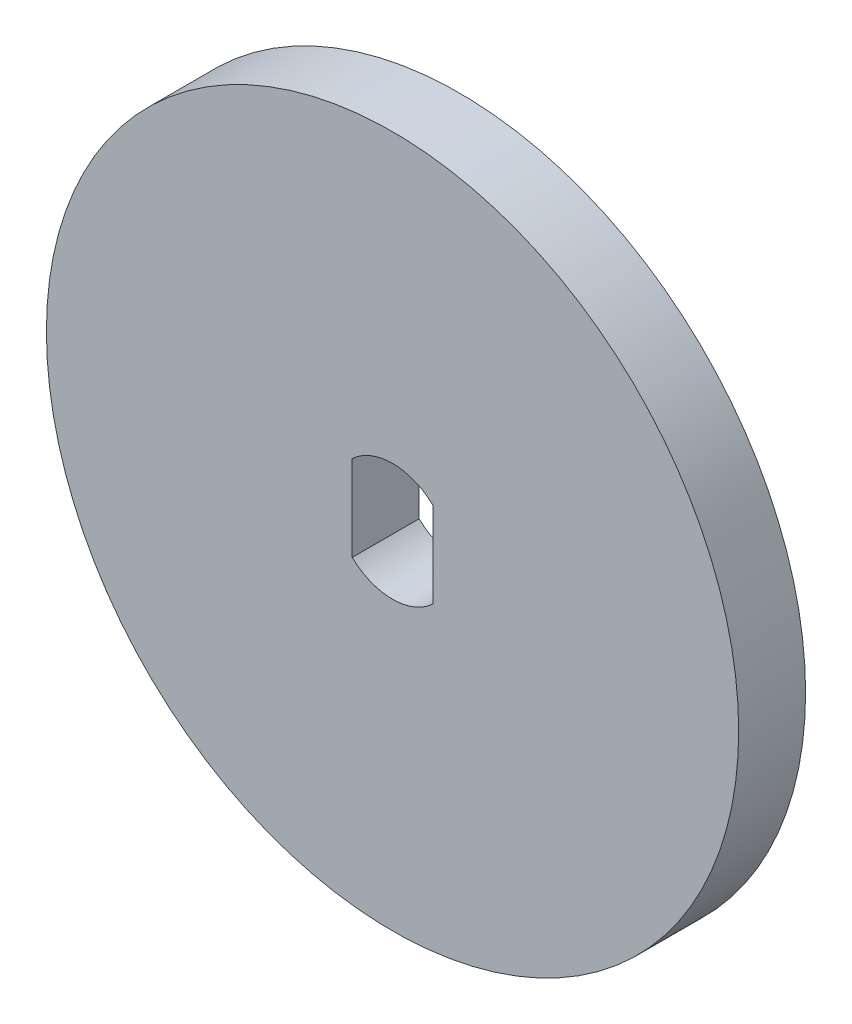
ISO-10303-21;
HEADER;
FILE_DESCRIPTION(('STEP AP214'),'2;1');
FILE_NAME('part.step','',(''),(''),'','','');
FILE_SCHEMA(('AUTOMOTIVE_DESIGN { 1 0 10303 214 1 1 1 1 }'));
ENDSEC;
DATA;
#1=APPLICATION_CONTEXT('core data for automotive mechanical design processes');
#2=APPLICATION_PROTOCOL_DEFINITION('international standard','automotive_design',2000,#1);
#3=PRODUCT_CONTEXT('',#1,'mechanical');
#4=PRODUCT('Part','Part','',(#3));
#5=PRODUCT_RELATED_PRODUCT_CATEGORY('part','',(#4));
#6=PRODUCT_DEFINITION_FORMATION('','',#4);
#7=PRODUCT_DEFINITION_CONTEXT('part definition',#1,'design');
#8=PRODUCT_DEFINITION('design','',#6,#7);
#9=PRODUCT_DEFINITION_SHAPE('','',#8);
#10=(LENGTH_UNIT() NAMED_UNIT(*) SI_UNIT(.MILLI.,.METRE.));
#11=(NAMED_UNIT(*) PLANE_ANGLE_UNIT() SI_UNIT($,.RADIAN.));
#12=(NAMED_UNIT(*) SI_UNIT($,.STERADIAN.) SOLID_ANGLE_UNIT());
#13=UNCERTAINTY_MEASURE_WITH_UNIT(LENGTH_MEASURE(1.E-05),#10,'distance_accuracy_value','');
#14=(GEOMETRIC_REPRESENTATION_CONTEXT(3) GLOBAL_UNCERTAINTY_ASSIGNED_CONTEXT((#13)) GLOBAL_UNIT_ASSIGNED_CONTEXT((#10,
#11,#12)) REPRESENTATION_CONTEXT('',''));
#15=CARTESIAN_POINT('',(0.,0.,0.));
#16=DIRECTION('',(0.,0.,1.));
#17=DIRECTION('',(1.,0.,0.));
#18=AXIS2_PLACEMENT_3D('',#15,#16,#17);
#19=CARTESIAN_POINT('',(0.,0.,1.45));
#20=DIRECTION('',(0.,0.,1.));
#21=DIRECTION('',(1.,0.,0.));
#22=AXIS2_PLACEMENT_3D('',#19,#20,#21);
#23=PLANE('',#22);
#24=CARTESIAN_POINT('',(0.,0.,1.45));
#25=DIRECTION('',(0.,0.,1.));
#26=DIRECTION('',(1.,0.,0.));
#27=AXIS2_PLACEMENT_3D('',#24,#25,#26);
#28=CIRCLE('',#27,15.);
#29=CARTESIAN_POINT('',(15.,0.,1.45));
#30=VERTEX_POINT('',#29);
#31=EDGE_CURVE('E11',#30,#30,#28,.T.);
#32=ORIENTED_EDGE('',*,*,#31,.T.);
#33=EDGE_LOOP('',(#32));
#34=FACE_BOUND('',#33,.T.);
#35=DIRECTION('',(0.,-1.,0.));
#36=VECTOR('',#35,1.);
#37=CARTESIAN_POINT('',(-1.75,-1.85472369909914,1.45));
#38=LINE('',#37,#36);
#39=CARTESIAN_POINT('',(-1.75,1.85472369909914,1.45));
#40=VERTEX_POINT('',#39);
#41=CARTESIAN_POINT('',(-1.75,-1.85472369909914,1.45));
#42=VERTEX_POINT('',#41);
#43=EDGE_CURVE('E90',#40,#42,#38,.T.);
#44=ORIENTED_EDGE('',*,*,#43,.F.);
#45=CARTESIAN_POINT('',(0.,0.,1.45));
#46=DIRECTION('',(0.,0.,1.));
#47=DIRECTION('',(1.,0.,0.));
#48=AXIS2_PLACEMENT_3D('',#45,#46,#47);
#49=CIRCLE('',#48,2.55);
#50=CARTESIAN_POINT('',(1.75,1.85472369909914,1.45));
#51=VERTEX_POINT('',#50);
#52=EDGE_CURVE('E81',#51,#40,#49,.T.);
#53=ORIENTED_EDGE('',*,*,#52,.F.);
#54=DIRECTION('',(0.,1.,0.));
#55=VECTOR('',#54,1.);
#56=CARTESIAN_POINT('',(1.75,-1.85472369909914,1.45));
#57=LINE('',#56,#55);
#58=CARTESIAN_POINT('',(1.75,-1.85472369909914,1.45));
#59=VERTEX_POINT('',#58);
#60=EDGE_CURVE('E106',#59,#51,#57,.T.);
#61=ORIENTED_EDGE('',*,*,#60,.F.);
#62=CARTESIAN_POINT('',(0.,0.,1.45));
#63=DIRECTION('',(0.,0.,1.));
#64=DIRECTION('',(1.,0.,0.));
#65=AXIS2_PLACEMENT_3D('',#62,#63,#64);
#66=CIRCLE('',#65,2.55);
#67=EDGE_CURVE('E102',#42,#59,#66,.T.);
#68=ORIENTED_EDGE('',*,*,#67,.F.);
#69=EDGE_LOOP('',(#44,#53,#61,#68));
#70=FACE_BOUND('',#69,.T.);
#71=ADVANCED_FACE('F39',(#34,#70),#23,.T.);
#72=CARTESIAN_POINT('',(0.,0.,-1.45));
#73=DIRECTION('',(0.,0.,1.));
#74=DIRECTION('',(1.,0.,0.));
#75=AXIS2_PLACEMENT_3D('',#72,#73,#74);
#76=PLANE('',#75);
#77=CARTESIAN_POINT('',(0.,0.,-1.45));
#78=DIRECTION('',(0.,0.,1.));
#79=DIRECTION('',(1.,0.,0.));
#80=AXIS2_PLACEMENT_3D('',#77,#78,#79);
#81=CIRCLE('',#80,15.);
#82=CARTESIAN_POINT('',(15.,0.,-1.45));
#83=VERTEX_POINT('',#82);
#84=EDGE_CURVE('E43',#83,#83,#81,.T.);
#85=ORIENTED_EDGE('',*,*,#84,.F.);
#86=EDGE_LOOP('',(#85));
#87=FACE_BOUND('',#86,.T.);
#88=CARTESIAN_POINT('',(0.,0.,-1.45));
#89=DIRECTION('',(0.,0.,1.));
#90=DIRECTION('',(1.,0.,0.));
#91=AXIS2_PLACEMENT_3D('',#88,#89,#90);
#92=CIRCLE('',#91,2.55);
#93=CARTESIAN_POINT('',(1.75,1.85472369909914,-1.45));
#94=VERTEX_POINT('',#93);
#95=CARTESIAN_POINT('',(-1.75,1.85472369909914,-1.45));
#96=VERTEX_POINT('',#95);
#97=EDGE_CURVE('E63',#94,#96,#92,.T.);
#98=ORIENTED_EDGE('',*,*,#97,.T.);
#99=DIRECTION('',(0.,-1.,0.));
#100=VECTOR('',#99,1.);
#101=CARTESIAN_POINT('',(-1.75,-1.85472369909914,-1.45));
#102=LINE('',#101,#100);
#103=CARTESIAN_POINT('',(-1.75,-1.85472369909914,-1.45));
#104=VERTEX_POINT('',#103);
#105=EDGE_CURVE('E97',#96,#104,#102,.T.);
#106=ORIENTED_EDGE('',*,*,#105,.T.);
#107=CARTESIAN_POINT('',(0.,0.,-1.45));
#108=DIRECTION('',(0.,0.,1.));
#109=DIRECTION('',(1.,0.,0.));
#110=AXIS2_PLACEMENT_3D('',#107,#108,#109);
#111=CIRCLE('',#110,2.55);
#112=CARTESIAN_POINT('',(1.75,-1.85472369909914,-1.45));
#113=VERTEX_POINT('',#112);
#114=EDGE_CURVE('E115',#104,#113,#111,.T.);
#115=ORIENTED_EDGE('',*,*,#114,.T.);
#116=DIRECTION('',(0.,1.,0.));
#117=VECTOR('',#116,1.);
#118=CARTESIAN_POINT('',(1.75,-1.85472369909914,-1.45));
#119=LINE('',#118,#117);
#120=EDGE_CURVE('E91',#113,#94,#119,.T.);
#121=ORIENTED_EDGE('',*,*,#120,.T.);
#122=EDGE_LOOP('',(#98,#106,#115,#121));
#123=FACE_BOUND('',#122,.T.);
#124=ADVANCED_FACE('F131',(#87,#123),#76,.F.);
#125=CARTESIAN_POINT('',(0.,0.,1.45));
#126=DIRECTION('',(0.,0.,-1.));
#127=DIRECTION('',(-1.,0.,0.));
#128=AXIS2_PLACEMENT_3D('',#125,#126,#127);
#129=CYLINDRICAL_SURFACE('',#128,15.);
#130=ORIENTED_EDGE('',*,*,#31,.F.);
#131=EDGE_LOOP('',(#130));
#132=FACE_BOUND('',#131,.T.);
#133=ORIENTED_EDGE('',*,*,#84,.T.);
#134=EDGE_LOOP('',(#133));
#135=FACE_BOUND('',#134,.T.);
#136=ADVANCED_FACE('F41',(#132,#135),#129,.T.);
#137=CARTESIAN_POINT('',(0.,0.,1.45));
#138=DIRECTION('',(0.,0.,-1.));
#139=DIRECTION('',(-1.,0.,0.));
#140=AXIS2_PLACEMENT_3D('',#137,#138,#139);
#141=CYLINDRICAL_SURFACE('',#140,2.55);
#142=ORIENTED_EDGE('',*,*,#97,.F.);
#143=DIRECTION('',(0.,0.,-1.));
#144=VECTOR('',#143,1.);
#145=CARTESIAN_POINT('',(1.75,1.85472369909914,1.45));
#146=LINE('',#145,#144);
#147=EDGE_CURVE('E85',#51,#94,#146,.T.);
#148=ORIENTED_EDGE('',*,*,#147,.F.);
#149=ORIENTED_EDGE('',*,*,#52,.T.);
#150=DIRECTION('',(0.,0.,-1.));
#151=VECTOR('',#150,1.);
#152=CARTESIAN_POINT('',(-1.75,1.85472369909914,1.45));
#153=LINE('',#152,#151);
#154=EDGE_CURVE('E84',#40,#96,#153,.T.);
#155=ORIENTED_EDGE('',*,*,#154,.T.);
#156=EDGE_LOOP('',(#142,#148,#149,#155));
#157=FACE_BOUND('',#156,.T.);
#158=ADVANCED_FACE('F83',(#157),#141,.F.);
#159=CARTESIAN_POINT('',(-1.75,-1.85472369909914,1.45));
#160=DIRECTION('',(1.,0.,0.));
#161=DIRECTION('',(0.,0.,-1.));
#162=AXIS2_PLACEMENT_3D('',#159,#160,#161);
#163=PLANE('',#162);
#164=ORIENTED_EDGE('',*,*,#105,.F.);
#165=ORIENTED_EDGE('',*,*,#154,.F.);
#166=ORIENTED_EDGE('',*,*,#43,.T.);
#167=DIRECTION('',(0.,0.,-1.));
#168=VECTOR('',#167,1.);
#169=CARTESIAN_POINT('',(-1.75,-1.85472369909914,1.45));
#170=LINE('',#169,#168);
#171=EDGE_CURVE('E99',#42,#104,#170,.T.);
#172=ORIENTED_EDGE('',*,*,#171,.T.);
#173=EDGE_LOOP('',(#164,#165,#166,#172));
#174=FACE_BOUND('',#173,.T.);
#175=ADVANCED_FACE('F94',(#174),#163,.T.);
#176=CARTESIAN_POINT('',(0.,0.,1.45));
#177=DIRECTION('',(0.,0.,-1.));
#178=DIRECTION('',(-1.,0.,0.));
#179=AXIS2_PLACEMENT_3D('',#176,#177,#178);
#180=CYLINDRICAL_SURFACE('',#179,2.55);
#181=ORIENTED_EDGE('',*,*,#114,.F.);
#182=ORIENTED_EDGE('',*,*,#171,.F.);
#183=ORIENTED_EDGE('',*,*,#67,.T.);
#184=DIRECTION('',(0.,0.,-1.));
#185=VECTOR('',#184,1.);
#186=CARTESIAN_POINT('',(1.75,-1.85472369909914,1.45));
#187=LINE('',#186,#185);
#188=EDGE_CURVE('E55',#59,#113,#187,.T.);
#189=ORIENTED_EDGE('',*,*,#188,.T.);
#190=EDGE_LOOP('',(#181,#182,#183,#189));
#191=FACE_BOUND('',#190,.T.);
#192=ADVANCED_FACE('F129',(#191),#180,.F.);
#193=CARTESIAN_POINT('',(1.75,-1.85472369909914,1.45));
#194=DIRECTION('',(-1.,0.,0.));
#195=DIRECTION('',(0.,0.,1.));
#196=AXIS2_PLACEMENT_3D('',#193,#194,#195);
#197=PLANE('',#196);
#198=ORIENTED_EDGE('',*,*,#120,.F.);
#199=ORIENTED_EDGE('',*,*,#188,.F.);
#200=ORIENTED_EDGE('',*,*,#60,.T.);
#201=ORIENTED_EDGE('',*,*,#147,.T.);
#202=EDGE_LOOP('',(#198,#199,#200,#201));
#203=FACE_BOUND('',#202,.T.);
#204=ADVANCED_FACE('F132',(#203),#197,.T.);
#205=CLOSED_SHELL('',(#71,#124,#136,#158,#175,#192,#204));
#206=MANIFOLD_SOLID_BREP('B2',#205);
#207=ADVANCED_BREP_SHAPE_REPRESENTATION('',(#18,#206),#14);
#208=SHAPE_DEFINITION_REPRESENTATION(#9,#207);
ENDSEC;
END-ISO-10303-21;
